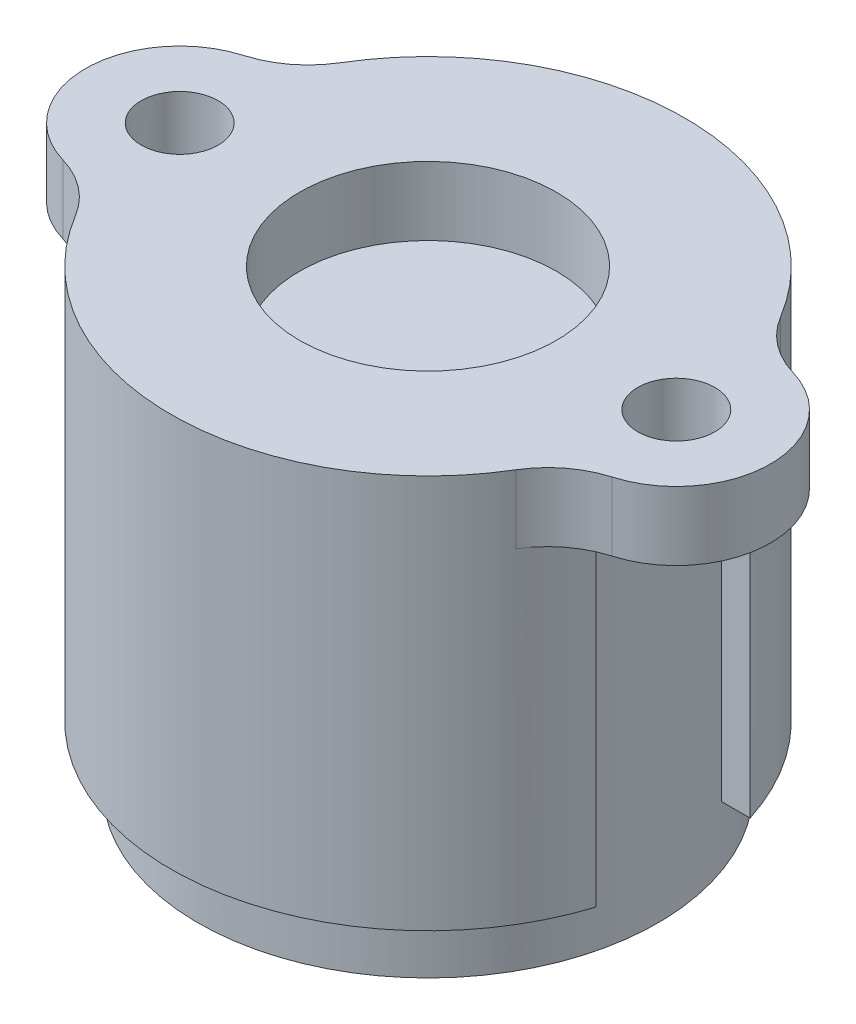
ISO-10303-21;
HEADER;
FILE_DESCRIPTION(('STEP AP214'),'2;1');
FILE_NAME('part.step','',(''),(''),'','','');
FILE_SCHEMA(('AUTOMOTIVE_DESIGN { 1 0 10303 214 1 1 1 1 }'));
ENDSEC;
DATA;
#1=APPLICATION_CONTEXT('core data for automotive mechanical design processes');
#2=APPLICATION_PROTOCOL_DEFINITION('international standard','automotive_design',2000,#1);
#3=PRODUCT_CONTEXT('',#1,'mechanical');
#4=PRODUCT('Part','Part','',(#3));
#5=PRODUCT_RELATED_PRODUCT_CATEGORY('part','',(#4));
#6=PRODUCT_DEFINITION_FORMATION('','',#4);
#7=PRODUCT_DEFINITION_CONTEXT('part definition',#1,'design');
#8=PRODUCT_DEFINITION('design','',#6,#7);
#9=PRODUCT_DEFINITION_SHAPE('','',#8);
#10=(LENGTH_UNIT() NAMED_UNIT(*) SI_UNIT(.MILLI.,.METRE.));
#11=(NAMED_UNIT(*) PLANE_ANGLE_UNIT() SI_UNIT($,.RADIAN.));
#12=(NAMED_UNIT(*) SI_UNIT($,.STERADIAN.) SOLID_ANGLE_UNIT());
#13=UNCERTAINTY_MEASURE_WITH_UNIT(LENGTH_MEASURE(1.E-05),#10,'distance_accuracy_value','');
#14=(GEOMETRIC_REPRESENTATION_CONTEXT(3) GLOBAL_UNCERTAINTY_ASSIGNED_CONTEXT((#13)) GLOBAL_UNIT_ASSIGNED_CONTEXT((#10,
#11,#12)) REPRESENTATION_CONTEXT('',''));
#15=CARTESIAN_POINT('',(0.,0.,0.));
#16=DIRECTION('',(0.,0.,1.));
#17=DIRECTION('',(1.,0.,0.));
#18=AXIS2_PLACEMENT_3D('',#15,#16,#17);
#19=CARTESIAN_POINT('',(8.14551724137931,0.,-2.6830558828307));
#20=DIRECTION('',(0.,1.,0.));
#21=DIRECTION('',(0.,0.,1.));
#22=AXIS2_PLACEMENT_3D('',#19,#20,#21);
#23=PLANE('',#22);
#24=CARTESIAN_POINT('',(0.,0.,0.));
#25=DIRECTION('',(0.,-1.,0.));
#26=DIRECTION('',(0.,0.,-1.));
#27=AXIS2_PLACEMENT_3D('',#24,#25,#26);
#28=CIRCLE('',#27,6.82);
#29=CARTESIAN_POINT('',(-6.42546527498204,0.,2.286));
#30=VERTEX_POINT('',#29);
#31=CARTESIAN_POINT('',(-6.7515549144719,0.,0.963797819498657));
#32=VERTEX_POINT('',#31);
#33=EDGE_CURVE('E449',#30,#32,#28,.T.);
#34=ORIENTED_EDGE('',*,*,#33,.F.);
#35=DIRECTION('',(-1.,0.,0.));
#36=VECTOR('',#35,1.);
#37=CARTESIAN_POINT('',(-12.9144244558121,0.,2.286));
#38=LINE('',#37,#36);
#39=CARTESIAN_POINT('',(-7.26901671479713,0.,2.286));
#40=VERTEX_POINT('',#39);
#41=EDGE_CURVE('E331',#30,#40,#38,.T.);
#42=ORIENTED_EDGE('',*,*,#41,.T.);
#43=CARTESIAN_POINT('',(0.,0.,0.));
#44=DIRECTION('',(0.,-1.,0.));
#45=DIRECTION('',(0.,0.,-1.));
#46=AXIS2_PLACEMENT_3D('',#43,#44,#45);
#47=CIRCLE('',#46,7.62);
#48=CARTESIAN_POINT('',(-6.53051303616484,0.,3.92642324316687));
#49=VERTEX_POINT('',#48);
#50=EDGE_CURVE('E313',#49,#40,#47,.T.);
#51=ORIENTED_EDGE('',*,*,#50,.F.);
#52=CARTESIAN_POINT('',(-8.92503448275862,0.,5.36611176566138));
#53=DIRECTION('',(0.,-1.,0.));
#54=DIRECTION('',(0.,0.,1.));
#55=AXIS2_PLACEMENT_3D('',#52,#53,#54);
#56=CIRCLE('',#55,2.794);
#57=CARTESIAN_POINT('',(-8.14551724137931,0.,2.68305588283069));
#58=VERTEX_POINT('',#57);
#59=EDGE_CURVE('E246',#58,#49,#56,.T.);
#60=ORIENTED_EDGE('',*,*,#59,.F.);
#61=CARTESIAN_POINT('',(-7.366,0.,0.));
#62=DIRECTION('',(0.,1.,0.));
#63=DIRECTION('',(0.,0.,1.));
#64=AXIS2_PLACEMENT_3D('',#61,#62,#63);
#65=CIRCLE('',#64,2.794);
#66=CARTESIAN_POINT('',(-8.14551724137931,0.,-2.68305588283069));
#67=VERTEX_POINT('',#66);
#68=EDGE_CURVE('E250',#67,#58,#65,.T.);
#69=ORIENTED_EDGE('',*,*,#68,.F.);
#70=CARTESIAN_POINT('',(-8.92503448275862,0.,-5.36611176566138));
#71=DIRECTION('',(0.,-1.,0.));
#72=DIRECTION('',(0.,0.,1.));
#73=AXIS2_PLACEMENT_3D('',#70,#71,#72);
#74=CIRCLE('',#73,2.794);
#75=CARTESIAN_POINT('',(-6.53051303616485,0.,-3.92642324316686));
#76=VERTEX_POINT('',#75);
#77=EDGE_CURVE('E253',#76,#67,#74,.T.);
#78=ORIENTED_EDGE('',*,*,#77,.F.);
#79=CARTESIAN_POINT('',(-7.26901671479713,0.,-2.286));
#80=VERTEX_POINT('',#79);
#81=EDGE_CURVE('E209',#80,#76,#47,.T.);
#82=ORIENTED_EDGE('',*,*,#81,.F.);
#83=DIRECTION('',(1.,0.,0.));
#84=VECTOR('',#83,1.);
#85=CARTESIAN_POINT('',(-12.9144244558121,0.,-2.286));
#86=LINE('',#85,#84);
#87=CARTESIAN_POINT('',(-6.42546527498204,0.,-2.286));
#88=VERTEX_POINT('',#87);
#89=EDGE_CURVE('E175',#80,#88,#86,.T.);
#90=ORIENTED_EDGE('',*,*,#89,.T.);
#91=CARTESIAN_POINT('',(-6.7515549144719,0.,-0.963797819498654));
#92=VERTEX_POINT('',#91);
#93=EDGE_CURVE('E57',#92,#88,#28,.T.);
#94=ORIENTED_EDGE('',*,*,#93,.F.);
#95=CARTESIAN_POINT('',(-7.366,0.,0.));
#96=DIRECTION('',(0.,1.,0.));
#97=DIRECTION('',(0.,0.,1.));
#98=AXIS2_PLACEMENT_3D('',#95,#96,#97);
#99=CIRCLE('',#98,1.143);
#100=EDGE_CURVE('E61',#92,#32,#99,.T.);
#101=ORIENTED_EDGE('',*,*,#100,.T.);
#102=EDGE_LOOP('',(#34,#42,#51,#60,#69,#78,#82,#90,#94,#101));
#103=FACE_BOUND('',#102,.T.);
#104=ADVANCED_FACE('F41',(#103),#23,.F.);
#105=CARTESIAN_POINT('',(6.42546527498204,0.,-2.286));
#106=VERTEX_POINT('',#105);
#107=CARTESIAN_POINT('',(6.7515549144719,0.,-0.963797819498656));
#108=VERTEX_POINT('',#107);
#109=EDGE_CURVE('E179',#106,#108,#28,.T.);
#110=ORIENTED_EDGE('',*,*,#109,.F.);
#111=CARTESIAN_POINT('',(7.26901671479713,0.,-2.286));
#112=VERTEX_POINT('',#111);
#113=EDGE_CURVE('E164',#106,#112,#86,.T.);
#114=ORIENTED_EDGE('',*,*,#113,.T.);
#115=CARTESIAN_POINT('',(6.53051303616484,0.,-3.92642324316687));
#116=VERTEX_POINT('',#115);
#117=EDGE_CURVE('E308',#116,#112,#47,.T.);
#118=ORIENTED_EDGE('',*,*,#117,.F.);
#119=CARTESIAN_POINT('',(8.92503448275862,0.,-5.36611176566139));
#120=DIRECTION('',(0.,-1.,0.));
#121=DIRECTION('',(0.,0.,1.));
#122=AXIS2_PLACEMENT_3D('',#119,#120,#121);
#123=CIRCLE('',#122,2.794);
#124=CARTESIAN_POINT('',(8.14551724137931,0.,-2.6830558828307));
#125=VERTEX_POINT('',#124);
#126=EDGE_CURVE('E256',#125,#116,#123,.T.);
#127=ORIENTED_EDGE('',*,*,#126,.F.);
#128=CARTESIAN_POINT('',(7.366,0.,0.));
#129=DIRECTION('',(0.,1.,0.));
#130=DIRECTION('',(0.,0.,1.));
#131=AXIS2_PLACEMENT_3D('',#128,#129,#130);
#132=CIRCLE('',#131,2.794);
#133=CARTESIAN_POINT('',(8.14551724137931,0.,2.68305588283069));
#134=VERTEX_POINT('',#133);
#135=EDGE_CURVE('E239',#134,#125,#132,.T.);
#136=ORIENTED_EDGE('',*,*,#135,.F.);
#137=CARTESIAN_POINT('',(8.92503448275862,0.,5.36611176566138));
#138=DIRECTION('',(0.,-1.,0.));
#139=DIRECTION('',(0.,0.,-1.));
#140=AXIS2_PLACEMENT_3D('',#137,#138,#139);
#141=CIRCLE('',#140,2.794);
#142=CARTESIAN_POINT('',(6.53051303616485,0.,3.92642324316686));
#143=VERTEX_POINT('',#142);
#144=EDGE_CURVE('E243',#143,#134,#141,.T.);
#145=ORIENTED_EDGE('',*,*,#144,.F.);
#146=CARTESIAN_POINT('',(7.26901671479713,0.,2.286));
#147=VERTEX_POINT('',#146);
#148=EDGE_CURVE('E202',#147,#143,#47,.T.);
#149=ORIENTED_EDGE('',*,*,#148,.F.);
#150=CARTESIAN_POINT('',(6.42546527498204,0.,2.286));
#151=VERTEX_POINT('',#150);
#152=EDGE_CURVE('E176',#147,#151,#38,.T.);
#153=ORIENTED_EDGE('',*,*,#152,.T.);
#154=CARTESIAN_POINT('',(6.7515549144719,0.,0.963797819498652));
#155=VERTEX_POINT('',#154);
#156=EDGE_CURVE('E441',#155,#151,#28,.T.);
#157=ORIENTED_EDGE('',*,*,#156,.F.);
#158=CARTESIAN_POINT('',(7.366,0.,0.));
#159=DIRECTION('',(0.,1.,0.));
#160=DIRECTION('',(0.,0.,1.));
#161=AXIS2_PLACEMENT_3D('',#158,#159,#160);
#162=CIRCLE('',#161,1.143);
#163=EDGE_CURVE('E182',#155,#108,#162,.T.);
#164=ORIENTED_EDGE('',*,*,#163,.T.);
#165=EDGE_LOOP('',(#110,#114,#118,#127,#136,#145,#149,#153,#157,#164));
#166=FACE_BOUND('',#165,.T.);
#167=ADVANCED_FACE('F180',(#166),#23,.F.);
#168=CARTESIAN_POINT('',(0.,2.032,0.));
#169=DIRECTION('',(0.,-1.,0.));
#170=DIRECTION('',(0.,0.,-1.));
#171=AXIS2_PLACEMENT_3D('',#168,#169,#170);
#172=CYLINDRICAL_SURFACE('',#171,7.62);
#173=DIRECTION('',(0.,-1.,0.));
#174=VECTOR('',#173,1.);
#175=CARTESIAN_POINT('',(7.26901671479713,2.032,2.286));
#176=LINE('',#175,#174);
#177=CARTESIAN_POINT('',(7.26901671479713,-9.652,2.286));
#178=VERTEX_POINT('',#177);
#179=EDGE_CURVE('E319',#147,#178,#176,.T.);
#180=ORIENTED_EDGE('',*,*,#179,.F.);
#181=ORIENTED_EDGE('',*,*,#148,.T.);
#182=DIRECTION('',(0.,-1.,0.));
#183=VECTOR('',#182,1.);
#184=CARTESIAN_POINT('',(6.53051303616485,2.032,3.92642324316686));
#185=LINE('',#184,#183);
#186=CARTESIAN_POINT('',(6.53051303616485,2.032,3.92642324316686));
#187=VERTEX_POINT('',#186);
#188=EDGE_CURVE('E226',#187,#143,#185,.T.);
#189=ORIENTED_EDGE('',*,*,#188,.F.);
#190=CARTESIAN_POINT('',(0.,2.032,0.));
#191=DIRECTION('',(0.,1.,0.));
#192=DIRECTION('',(0.,0.,1.));
#193=AXIS2_PLACEMENT_3D('',#190,#191,#192);
#194=CIRCLE('',#193,7.62);
#195=CARTESIAN_POINT('',(-6.53051303616485,2.032,3.92642324316687));
#196=VERTEX_POINT('',#195);
#197=EDGE_CURVE('E266',#196,#187,#194,.T.);
#198=ORIENTED_EDGE('',*,*,#197,.F.);
#199=DIRECTION('',(0.,-1.,0.));
#200=VECTOR('',#199,1.);
#201=CARTESIAN_POINT('',(-6.53051303616485,2.032,3.92642324316687));
#202=LINE('',#201,#200);
#203=EDGE_CURVE('E222',#196,#49,#202,.T.);
#204=ORIENTED_EDGE('',*,*,#203,.T.);
#205=ORIENTED_EDGE('',*,*,#50,.T.);
#206=DIRECTION('',(0.,-1.,0.));
#207=VECTOR('',#206,1.);
#208=CARTESIAN_POINT('',(-7.26901671479713,2.032,2.286));
#209=LINE('',#208,#207);
#210=CARTESIAN_POINT('',(-7.26901671479713,-9.652,2.286));
#211=VERTEX_POINT('',#210);
#212=EDGE_CURVE('E322',#211,#40,#209,.F.);
#213=ORIENTED_EDGE('',*,*,#212,.F.);
#214=CARTESIAN_POINT('',(0.,-9.652,0.));
#215=DIRECTION('',(0.,-1.,0.));
#216=DIRECTION('',(0.,0.,-1.));
#217=AXIS2_PLACEMENT_3D('',#214,#215,#216);
#218=CIRCLE('',#217,7.62);
#219=EDGE_CURVE('E296',#178,#211,#218,.T.);
#220=ORIENTED_EDGE('',*,*,#219,.F.);
#221=EDGE_LOOP('',(#180,#181,#189,#198,#204,#205,#213,#220));
#222=FACE_BOUND('',#221,.T.);
#223=ADVANCED_FACE('F365',(#222),#172,.T.);
#224=DIRECTION('',(0.,-1.,0.));
#225=VECTOR('',#224,1.);
#226=CARTESIAN_POINT('',(-7.26901671479713,2.032,-2.286));
#227=LINE('',#226,#225);
#228=CARTESIAN_POINT('',(-7.26901671479713,-9.652,-2.286));
#229=VERTEX_POINT('',#228);
#230=EDGE_CURVE('E325',#80,#229,#227,.T.);
#231=ORIENTED_EDGE('',*,*,#230,.F.);
#232=ORIENTED_EDGE('',*,*,#81,.T.);
#233=DIRECTION('',(0.,-1.,0.));
#234=VECTOR('',#233,1.);
#235=CARTESIAN_POINT('',(-6.53051303616484,2.032,-3.92642324316687));
#236=LINE('',#235,#234);
#237=CARTESIAN_POINT('',(-6.53051303616484,2.032,-3.92642324316687));
#238=VERTEX_POINT('',#237);
#239=EDGE_CURVE('E210',#238,#76,#236,.T.);
#240=ORIENTED_EDGE('',*,*,#239,.F.);
#241=CARTESIAN_POINT('',(0.,2.032,0.));
#242=DIRECTION('',(0.,1.,0.));
#243=DIRECTION('',(0.,0.,1.));
#244=AXIS2_PLACEMENT_3D('',#241,#242,#243);
#245=CIRCLE('',#244,7.62);
#246=CARTESIAN_POINT('',(6.53051303616484,2.032,-3.92642324316687));
#247=VERTEX_POINT('',#246);
#248=EDGE_CURVE('E278',#247,#238,#245,.T.);
#249=ORIENTED_EDGE('',*,*,#248,.F.);
#250=DIRECTION('',(0.,-1.,0.));
#251=VECTOR('',#250,1.);
#252=CARTESIAN_POINT('',(6.53051303616484,2.032,-3.92642324316687));
#253=LINE('',#252,#251);
#254=EDGE_CURVE('E205',#247,#116,#253,.T.);
#255=ORIENTED_EDGE('',*,*,#254,.T.);
#256=ORIENTED_EDGE('',*,*,#117,.T.);
#257=DIRECTION('',(0.,-1.,0.));
#258=VECTOR('',#257,1.);
#259=CARTESIAN_POINT('',(7.26901671479713,2.032,-2.286));
#260=LINE('',#259,#258);
#261=CARTESIAN_POINT('',(7.26901671479713,-9.652,-2.286));
#262=VERTEX_POINT('',#261);
#263=EDGE_CURVE('E171',#262,#112,#260,.F.);
#264=ORIENTED_EDGE('',*,*,#263,.F.);
#265=EDGE_CURVE('E311',#229,#262,#218,.T.);
#266=ORIENTED_EDGE('',*,*,#265,.F.);
#267=EDGE_LOOP('',(#231,#232,#240,#249,#255,#256,#264,#266));
#268=FACE_BOUND('',#267,.T.);
#269=ADVANCED_FACE('F381',(#268),#172,.T.);
#270=CARTESIAN_POINT('',(0.,-9.652,0.));
#271=DIRECTION('',(0.,-1.,0.));
#272=DIRECTION('',(0.,0.,-1.));
#273=AXIS2_PLACEMENT_3D('',#270,#271,#272);
#274=PLANE('',#273);
#275=ORIENTED_EDGE('',*,*,#219,.T.);
#276=DIRECTION('',(-1.,0.,0.));
#277=VECTOR('',#276,1.);
#278=CARTESIAN_POINT('',(-12.9144244558121,-9.652,2.286));
#279=LINE('',#278,#277);
#280=CARTESIAN_POINT('',(-6.42546527498204,-9.652,2.286));
#281=VERTEX_POINT('',#280);
#282=EDGE_CURVE('E339',#281,#211,#279,.T.);
#283=ORIENTED_EDGE('',*,*,#282,.F.);
#284=CARTESIAN_POINT('',(0.,-9.652,0.));
#285=DIRECTION('',(0.,-1.,0.));
#286=DIRECTION('',(0.,0.,-1.));
#287=AXIS2_PLACEMENT_3D('',#284,#285,#286);
#288=CIRCLE('',#287,6.82);
#289=CARTESIAN_POINT('',(6.42546527498204,-9.652,2.286));
#290=VERTEX_POINT('',#289);
#291=EDGE_CURVE('E312',#290,#281,#288,.T.);
#292=ORIENTED_EDGE('',*,*,#291,.F.);
#293=EDGE_CURVE('E338',#178,#290,#279,.T.);
#294=ORIENTED_EDGE('',*,*,#293,.F.);
#295=EDGE_LOOP('',(#275,#283,#292,#294));
#296=FACE_BOUND('',#295,.T.);
#297=ADVANCED_FACE('F467',(#296),#274,.T.);
#298=ORIENTED_EDGE('',*,*,#265,.T.);
#299=DIRECTION('',(1.,0.,0.));
#300=VECTOR('',#299,1.);
#301=CARTESIAN_POINT('',(-12.9144244558121,-9.652,-2.286));
#302=LINE('',#301,#300);
#303=CARTESIAN_POINT('',(6.42546527498204,-9.652,-2.286));
#304=VERTEX_POINT('',#303);
#305=EDGE_CURVE('E335',#304,#262,#302,.T.);
#306=ORIENTED_EDGE('',*,*,#305,.F.);
#307=CARTESIAN_POINT('',(-6.42546527498204,-9.652,-2.286));
#308=VERTEX_POINT('',#307);
#309=EDGE_CURVE('E195',#308,#304,#288,.T.);
#310=ORIENTED_EDGE('',*,*,#309,.F.);
#311=EDGE_CURVE('E329',#229,#308,#302,.T.);
#312=ORIENTED_EDGE('',*,*,#311,.F.);
#313=EDGE_LOOP('',(#298,#306,#310,#312));
#314=FACE_BOUND('',#313,.T.);
#315=ADVANCED_FACE('F395',(#314),#274,.T.);
#316=CARTESIAN_POINT('',(8.92503448275862,2.032,-5.36611176566139));
#317=DIRECTION('',(0.,-1.,0.));
#318=DIRECTION('',(0.,0.,-1.));
#319=AXIS2_PLACEMENT_3D('',#316,#317,#318);
#320=CYLINDRICAL_SURFACE('',#319,2.794);
#321=ORIENTED_EDGE('',*,*,#126,.T.);
#322=ORIENTED_EDGE('',*,*,#254,.F.);
#323=CARTESIAN_POINT('',(8.92503448275862,2.032,-5.36611176566139));
#324=DIRECTION('',(0.,-1.,0.));
#325=DIRECTION('',(0.,0.,1.));
#326=AXIS2_PLACEMENT_3D('',#323,#324,#325);
#327=CIRCLE('',#326,2.794);
#328=CARTESIAN_POINT('',(8.14551724137931,2.032,-2.6830558828307));
#329=VERTEX_POINT('',#328);
#330=EDGE_CURVE('E242',#329,#247,#327,.T.);
#331=ORIENTED_EDGE('',*,*,#330,.F.);
#332=DIRECTION('',(0.,-1.,0.));
#333=VECTOR('',#332,1.);
#334=CARTESIAN_POINT('',(8.14551724137931,2.032,-2.6830558828307));
#335=LINE('',#334,#333);
#336=EDGE_CURVE('E234',#329,#125,#335,.T.);
#337=ORIENTED_EDGE('',*,*,#336,.T.);
#338=EDGE_LOOP('',(#321,#322,#331,#337));
#339=FACE_BOUND('',#338,.T.);
#340=ADVANCED_FACE('F43',(#339),#320,.F.);
#341=CARTESIAN_POINT('',(-8.92503448275862,2.032,-5.36611176566138));
#342=DIRECTION('',(0.,-1.,0.));
#343=DIRECTION('',(0.,0.,-1.));
#344=AXIS2_PLACEMENT_3D('',#341,#342,#343);
#345=CYLINDRICAL_SURFACE('',#344,2.794);
#346=ORIENTED_EDGE('',*,*,#77,.T.);
#347=DIRECTION('',(0.,-1.,0.));
#348=VECTOR('',#347,1.);
#349=CARTESIAN_POINT('',(-8.14551724137931,2.032,-2.68305588283069));
#350=LINE('',#349,#348);
#351=CARTESIAN_POINT('',(-8.14551724137931,2.032,-2.68305588283069));
#352=VERTEX_POINT('',#351);
#353=EDGE_CURVE('E214',#352,#67,#350,.T.);
#354=ORIENTED_EDGE('',*,*,#353,.F.);
#355=CARTESIAN_POINT('',(-8.92503448275862,2.032,-5.36611176566138));
#356=DIRECTION('',(0.,-1.,0.));
#357=DIRECTION('',(0.,0.,1.));
#358=AXIS2_PLACEMENT_3D('',#355,#356,#357);
#359=CIRCLE('',#358,2.794);
#360=EDGE_CURVE('E275',#238,#352,#359,.T.);
#361=ORIENTED_EDGE('',*,*,#360,.F.);
#362=ORIENTED_EDGE('',*,*,#239,.T.);
#363=EDGE_LOOP('',(#346,#354,#361,#362));
#364=FACE_BOUND('',#363,.T.);
#365=ADVANCED_FACE('F388',(#364),#345,.F.);
#366=CARTESIAN_POINT('',(-7.366,2.032,0.));
#367=DIRECTION('',(0.,-1.,0.));
#368=DIRECTION('',(0.,0.,-1.));
#369=AXIS2_PLACEMENT_3D('',#366,#367,#368);
#370=CYLINDRICAL_SURFACE('',#369,2.794);
#371=ORIENTED_EDGE('',*,*,#68,.T.);
#372=DIRECTION('',(0.,-1.,0.));
#373=VECTOR('',#372,1.);
#374=CARTESIAN_POINT('',(-8.14551724137931,2.032,2.68305588283069));
#375=LINE('',#374,#373);
#376=CARTESIAN_POINT('',(-8.14551724137931,2.032,2.68305588283069));
#377=VERTEX_POINT('',#376);
#378=EDGE_CURVE('E218',#377,#58,#375,.T.);
#379=ORIENTED_EDGE('',*,*,#378,.F.);
#380=CARTESIAN_POINT('',(-7.366,2.032,0.));
#381=DIRECTION('',(0.,1.,0.));
#382=DIRECTION('',(0.,0.,1.));
#383=AXIS2_PLACEMENT_3D('',#380,#381,#382);
#384=CIRCLE('',#383,2.794);
#385=EDGE_CURVE('E272',#352,#377,#384,.T.);
#386=ORIENTED_EDGE('',*,*,#385,.F.);
#387=ORIENTED_EDGE('',*,*,#353,.T.);
#388=EDGE_LOOP('',(#371,#379,#386,#387));
#389=FACE_BOUND('',#388,.T.);
#390=ADVANCED_FACE('F385',(#389),#370,.T.);
#391=CARTESIAN_POINT('',(-8.92503448275862,2.032,5.36611176566138));
#392=DIRECTION('',(0.,-1.,0.));
#393=DIRECTION('',(0.,0.,-1.));
#394=AXIS2_PLACEMENT_3D('',#391,#392,#393);
#395=CYLINDRICAL_SURFACE('',#394,2.794);
#396=ORIENTED_EDGE('',*,*,#59,.T.);
#397=ORIENTED_EDGE('',*,*,#203,.F.);
#398=CARTESIAN_POINT('',(-8.92503448275862,2.032,5.36611176566138));
#399=DIRECTION('',(0.,-1.,0.));
#400=DIRECTION('',(0.,0.,1.));
#401=AXIS2_PLACEMENT_3D('',#398,#399,#400);
#402=CIRCLE('',#401,2.794);
#403=EDGE_CURVE('E269',#377,#196,#402,.T.);
#404=ORIENTED_EDGE('',*,*,#403,.F.);
#405=ORIENTED_EDGE('',*,*,#378,.T.);
#406=EDGE_LOOP('',(#396,#397,#404,#405));
#407=FACE_BOUND('',#406,.T.);
#408=ADVANCED_FACE('F377',(#407),#395,.F.);
#409=CARTESIAN_POINT('',(8.92503448275862,2.032,5.36611176566138));
#410=DIRECTION('',(0.,-1.,0.));
#411=DIRECTION('',(0.,0.,-1.));
#412=AXIS2_PLACEMENT_3D('',#409,#410,#411);
#413=CYLINDRICAL_SURFACE('',#412,2.794);
#414=ORIENTED_EDGE('',*,*,#144,.T.);
#415=DIRECTION('',(0.,-1.,0.));
#416=VECTOR('',#415,1.);
#417=CARTESIAN_POINT('',(8.14551724137931,2.032,2.68305588283069));
#418=LINE('',#417,#416);
#419=CARTESIAN_POINT('',(8.14551724137931,2.032,2.68305588283069));
#420=VERTEX_POINT('',#419);
#421=EDGE_CURVE('E230',#420,#134,#418,.T.);
#422=ORIENTED_EDGE('',*,*,#421,.F.);
#423=CARTESIAN_POINT('',(8.92503448275862,2.032,5.36611176566138));
#424=DIRECTION('',(0.,-1.,0.));
#425=DIRECTION('',(0.,0.,-1.));
#426=AXIS2_PLACEMENT_3D('',#423,#424,#425);
#427=CIRCLE('',#426,2.794);
#428=EDGE_CURVE('E263',#187,#420,#427,.T.);
#429=ORIENTED_EDGE('',*,*,#428,.F.);
#430=ORIENTED_EDGE('',*,*,#188,.T.);
#431=EDGE_LOOP('',(#414,#422,#429,#430));
#432=FACE_BOUND('',#431,.T.);
#433=ADVANCED_FACE('F373',(#432),#413,.F.);
#434=CARTESIAN_POINT('',(7.366,2.032,0.));
#435=DIRECTION('',(0.,-1.,0.));
#436=DIRECTION('',(0.,0.,-1.));
#437=AXIS2_PLACEMENT_3D('',#434,#435,#436);
#438=CYLINDRICAL_SURFACE('',#437,2.794);
#439=ORIENTED_EDGE('',*,*,#135,.T.);
#440=ORIENTED_EDGE('',*,*,#336,.F.);
#441=CARTESIAN_POINT('',(7.366,2.032,0.));
#442=DIRECTION('',(0.,1.,0.));
#443=DIRECTION('',(0.,0.,1.));
#444=AXIS2_PLACEMENT_3D('',#441,#442,#443);
#445=CIRCLE('',#444,2.794);
#446=EDGE_CURVE('E238',#420,#329,#445,.T.);
#447=ORIENTED_EDGE('',*,*,#446,.F.);
#448=ORIENTED_EDGE('',*,*,#421,.T.);
#449=EDGE_LOOP('',(#439,#440,#447,#448));
#450=FACE_BOUND('',#449,.T.);
#451=ADVANCED_FACE('F370',(#450),#438,.T.);
#452=CARTESIAN_POINT('',(8.14551724137931,2.032,-2.6830558828307));
#453=DIRECTION('',(0.,1.,0.));
#454=DIRECTION('',(0.,0.,1.));
#455=AXIS2_PLACEMENT_3D('',#452,#453,#454);
#456=PLANE('',#455);
#457=CARTESIAN_POINT('',(7.366,2.032,0.));
#458=DIRECTION('',(0.,1.,0.));
#459=DIRECTION('',(0.,0.,1.));
#460=AXIS2_PLACEMENT_3D('',#457,#458,#459);
#461=CIRCLE('',#460,1.143);
#462=CARTESIAN_POINT('',(7.366,2.032,1.143));
#463=VERTEX_POINT('',#462);
#464=EDGE_CURVE('E292',#463,#463,#461,.T.);
#465=ORIENTED_EDGE('',*,*,#464,.F.);
#466=EDGE_LOOP('',(#465));
#467=FACE_BOUND('',#466,.T.);
#468=CARTESIAN_POINT('',(-7.366,2.032,0.));
#469=DIRECTION('',(0.,1.,0.));
#470=DIRECTION('',(0.,0.,1.));
#471=AXIS2_PLACEMENT_3D('',#468,#469,#470);
#472=CIRCLE('',#471,1.143);
#473=CARTESIAN_POINT('',(-7.366,2.032,1.143));
#474=VERTEX_POINT('',#473);
#475=EDGE_CURVE('E301',#474,#474,#472,.T.);
#476=ORIENTED_EDGE('',*,*,#475,.F.);
#477=EDGE_LOOP('',(#476));
#478=FACE_BOUND('',#477,.T.);
#479=CARTESIAN_POINT('',(0.,2.032,0.));
#480=DIRECTION('',(0.,1.,0.));
#481=DIRECTION('',(0.,0.,1.));
#482=AXIS2_PLACEMENT_3D('',#479,#480,#481);
#483=CIRCLE('',#482,3.81);
#484=CARTESIAN_POINT('',(0.,2.032,3.81));
#485=VERTEX_POINT('',#484);
#486=EDGE_CURVE('E284',#485,#485,#483,.T.);
#487=ORIENTED_EDGE('',*,*,#486,.F.);
#488=EDGE_LOOP('',(#487));
#489=FACE_BOUND('',#488,.T.);
#490=ORIENTED_EDGE('',*,*,#330,.T.);
#491=ORIENTED_EDGE('',*,*,#248,.T.);
#492=ORIENTED_EDGE('',*,*,#360,.T.);
#493=ORIENTED_EDGE('',*,*,#385,.T.);
#494=ORIENTED_EDGE('',*,*,#403,.T.);
#495=ORIENTED_EDGE('',*,*,#197,.T.);
#496=ORIENTED_EDGE('',*,*,#428,.T.);
#497=ORIENTED_EDGE('',*,*,#446,.T.);
#498=EDGE_LOOP('',(#490,#491,#492,#493,#494,#495,#496,#497));
#499=FACE_BOUND('',#498,.T.);
#500=ADVANCED_FACE('F368',(#467,#478,#489,#499),#456,.T.);
#501=CARTESIAN_POINT('',(0.,0.,0.));
#502=DIRECTION('',(0.,1.,0.));
#503=DIRECTION('',(0.,0.,1.));
#504=AXIS2_PLACEMENT_3D('',#501,#502,#503);
#505=CYLINDRICAL_SURFACE('',#504,3.81);
#506=CARTESIAN_POINT('',(0.,0.,0.));
#507=DIRECTION('',(0.,1.,0.));
#508=DIRECTION('',(0.,0.,1.));
#509=AXIS2_PLACEMENT_3D('',#506,#507,#508);
#510=CIRCLE('',#509,3.81);
#511=CARTESIAN_POINT('',(0.,0.,3.81));
#512=VERTEX_POINT('',#511);
#513=EDGE_CURVE('E260',#512,#512,#510,.T.);
#514=ORIENTED_EDGE('',*,*,#513,.F.);
#515=EDGE_LOOP('',(#514));
#516=FACE_BOUND('',#515,.T.);
#517=ORIENTED_EDGE('',*,*,#486,.T.);
#518=EDGE_LOOP('',(#517));
#519=FACE_BOUND('',#518,.T.);
#520=ADVANCED_FACE('F475',(#516,#519),#505,.F.);
#521=CARTESIAN_POINT('',(-7.366,0.,0.));
#522=DIRECTION('',(0.,1.,0.));
#523=DIRECTION('',(0.,0.,1.));
#524=AXIS2_PLACEMENT_3D('',#521,#522,#523);
#525=CYLINDRICAL_SURFACE('',#524,1.143);
#526=EDGE_CURVE('E288',#32,#92,#99,.T.);
#527=ORIENTED_EDGE('',*,*,#526,.F.);
#528=ORIENTED_EDGE('',*,*,#100,.F.);
#529=EDGE_LOOP('',(#527,#528));
#530=FACE_BOUND('',#529,.T.);
#531=ORIENTED_EDGE('',*,*,#475,.T.);
#532=EDGE_LOOP('',(#531));
#533=FACE_BOUND('',#532,.T.);
#534=ADVANCED_FACE('F471',(#530,#533),#525,.F.);
#535=CARTESIAN_POINT('',(7.366,0.,0.));
#536=DIRECTION('',(0.,1.,0.));
#537=DIRECTION('',(0.,0.,1.));
#538=AXIS2_PLACEMENT_3D('',#535,#536,#537);
#539=CYLINDRICAL_SURFACE('',#538,1.143);
#540=EDGE_CURVE('E297',#108,#155,#162,.T.);
#541=ORIENTED_EDGE('',*,*,#540,.F.);
#542=ORIENTED_EDGE('',*,*,#163,.F.);
#543=EDGE_LOOP('',(#541,#542));
#544=FACE_BOUND('',#543,.T.);
#545=ORIENTED_EDGE('',*,*,#464,.T.);
#546=EDGE_LOOP('',(#545));
#547=FACE_BOUND('',#546,.T.);
#548=ADVANCED_FACE('F474',(#544,#547),#539,.F.);
#549=CARTESIAN_POINT('',(-12.9144244558121,-9.652,2.286));
#550=DIRECTION('',(0.,0.,-1.));
#551=DIRECTION('',(-1.,0.,0.));
#552=AXIS2_PLACEMENT_3D('',#549,#550,#551);
#553=PLANE('',#552);
#554=ORIENTED_EDGE('',*,*,#212,.T.);
#555=ORIENTED_EDGE('',*,*,#41,.F.);
#556=DIRECTION('',(0.,1.,0.));
#557=VECTOR('',#556,1.);
#558=CARTESIAN_POINT('',(-6.42546527498204,-9.652,2.286));
#559=LINE('',#558,#557);
#560=EDGE_CURVE('E11',#281,#30,#559,.T.);
#561=ORIENTED_EDGE('',*,*,#560,.F.);
#562=ORIENTED_EDGE('',*,*,#282,.T.);
#563=EDGE_LOOP('',(#554,#555,#561,#562));
#564=FACE_BOUND('',#563,.T.);
#565=ADVANCED_FACE('F464',(#564),#553,.T.);
#566=ORIENTED_EDGE('',*,*,#179,.T.);
#567=ORIENTED_EDGE('',*,*,#293,.T.);
#568=DIRECTION('',(0.,1.,0.));
#569=VECTOR('',#568,1.);
#570=CARTESIAN_POINT('',(6.42546527498204,-9.652,2.286));
#571=LINE('',#570,#569);
#572=EDGE_CURVE('E50',#151,#290,#571,.F.);
#573=ORIENTED_EDGE('',*,*,#572,.F.);
#574=ORIENTED_EDGE('',*,*,#152,.F.);
#575=EDGE_LOOP('',(#566,#567,#573,#574));
#576=FACE_BOUND('',#575,.T.);
#577=ADVANCED_FACE('F443',(#576),#553,.T.);
#578=CARTESIAN_POINT('',(-12.9144244558121,-9.652,-2.286));
#579=DIRECTION('',(0.,0.,1.));
#580=DIRECTION('',(1.,0.,0.));
#581=AXIS2_PLACEMENT_3D('',#578,#579,#580);
#582=PLANE('',#581);
#583=ORIENTED_EDGE('',*,*,#230,.T.);
#584=ORIENTED_EDGE('',*,*,#311,.T.);
#585=DIRECTION('',(0.,1.,0.));
#586=VECTOR('',#585,1.);
#587=CARTESIAN_POINT('',(-6.42546527498204,-9.652,-2.286));
#588=LINE('',#587,#586);
#589=EDGE_CURVE('E197',#88,#308,#588,.F.);
#590=ORIENTED_EDGE('',*,*,#589,.F.);
#591=ORIENTED_EDGE('',*,*,#89,.F.);
#592=EDGE_LOOP('',(#583,#584,#590,#591));
#593=FACE_BOUND('',#592,.T.);
#594=ADVANCED_FACE('F458',(#593),#582,.T.);
#595=ORIENTED_EDGE('',*,*,#263,.T.);
#596=ORIENTED_EDGE('',*,*,#113,.F.);
#597=DIRECTION('',(0.,1.,0.));
#598=VECTOR('',#597,1.);
#599=CARTESIAN_POINT('',(6.42546527498204,-9.652,-2.286));
#600=LINE('',#599,#598);
#601=EDGE_CURVE('E168',#304,#106,#600,.T.);
#602=ORIENTED_EDGE('',*,*,#601,.F.);
#603=ORIENTED_EDGE('',*,*,#305,.T.);
#604=EDGE_LOOP('',(#595,#596,#602,#603));
#605=FACE_BOUND('',#604,.T.);
#606=ADVANCED_FACE('F166',(#605),#582,.T.);
#607=CARTESIAN_POINT('',(0.,-11.43,0.));
#608=DIRECTION('',(0.,-1.,0.));
#609=DIRECTION('',(0.,0.,-1.));
#610=AXIS2_PLACEMENT_3D('',#607,#608,#609);
#611=PLANE('',#610);
#612=CARTESIAN_POINT('',(0.,-11.43,0.));
#613=DIRECTION('',(0.,-1.,0.));
#614=DIRECTION('',(0.,0.,-1.));
#615=AXIS2_PLACEMENT_3D('',#612,#613,#614);
#616=CIRCLE('',#615,6.82);
#617=CARTESIAN_POINT('',(0.,-11.43,-6.82));
#618=VERTEX_POINT('',#617);
#619=EDGE_CURVE('E187',#618,#618,#616,.T.);
#620=ORIENTED_EDGE('',*,*,#619,.T.);
#621=EDGE_LOOP('',(#620));
#622=FACE_BOUND('',#621,.T.);
#623=ADVANCED_FACE('F346',(#622),#611,.T.);
#624=CARTESIAN_POINT('',(0.,-11.43,0.));
#625=DIRECTION('',(0.,1.,0.));
#626=DIRECTION('',(0.,0.,1.));
#627=AXIS2_PLACEMENT_3D('',#624,#625,#626);
#628=CYLINDRICAL_SURFACE('',#627,6.82);
#629=ORIENTED_EDGE('',*,*,#560,.T.);
#630=ORIENTED_EDGE('',*,*,#33,.T.);
#631=EDGE_CURVE('E453',#32,#92,#28,.T.);
#632=ORIENTED_EDGE('',*,*,#631,.T.);
#633=ORIENTED_EDGE('',*,*,#93,.T.);
#634=ORIENTED_EDGE('',*,*,#589,.T.);
#635=ORIENTED_EDGE('',*,*,#309,.T.);
#636=ORIENTED_EDGE('',*,*,#601,.T.);
#637=ORIENTED_EDGE('',*,*,#109,.T.);
#638=EDGE_CURVE('E188',#108,#155,#28,.T.);
#639=ORIENTED_EDGE('',*,*,#638,.T.);
#640=ORIENTED_EDGE('',*,*,#156,.T.);
#641=ORIENTED_EDGE('',*,*,#572,.T.);
#642=ORIENTED_EDGE('',*,*,#291,.T.);
#643=EDGE_LOOP('',(#629,#630,#632,#633,#634,#635,#636,#637,#639,#640,#641,#642));
#644=FACE_BOUND('',#643,.T.);
#645=ORIENTED_EDGE('',*,*,#619,.F.);
#646=EDGE_LOOP('',(#645));
#647=FACE_BOUND('',#646,.T.);
#648=ADVANCED_FACE('F191',(#644,#647),#628,.T.);
#649=CARTESIAN_POINT('',(0.,0.,0.));
#650=DIRECTION('',(0.,-1.,0.));
#651=DIRECTION('',(0.,0.,-1.));
#652=AXIS2_PLACEMENT_3D('',#649,#650,#651);
#653=PLANE('',#652);
#654=ORIENTED_EDGE('',*,*,#638,.F.);
#655=ORIENTED_EDGE('',*,*,#540,.T.);
#656=EDGE_LOOP('',(#654,#655));
#657=FACE_BOUND('',#656,.T.);
#658=ADVANCED_FACE('F348',(#657),#653,.F.);
#659=ORIENTED_EDGE('',*,*,#631,.F.);
#660=ORIENTED_EDGE('',*,*,#526,.T.);
#661=EDGE_LOOP('',(#659,#660));
#662=FACE_BOUND('',#661,.T.);
#663=ADVANCED_FACE('F354',(#662),#653,.F.);
#664=ORIENTED_EDGE('',*,*,#513,.T.);
#665=EDGE_LOOP('',(#664));
#666=FACE_BOUND('',#665,.T.);
#667=ADVANCED_FACE('F357',(#666),#653,.F.);
#668=CLOSED_SHELL('',(#104,#167,#223,#269,#297,#315,#340,#365,#390,#408,#433,#451,#500,#520,
#534,#548,#565,#577,#594,#606,#623,#648,#658,#663,#667));
#669=MANIFOLD_SOLID_BREP('B2',#668);
#670=ADVANCED_BREP_SHAPE_REPRESENTATION('',(#18,#669),#14);
#671=SHAPE_DEFINITION_REPRESENTATION(#9,#670);
ENDSEC;
END-ISO-10303-21;
